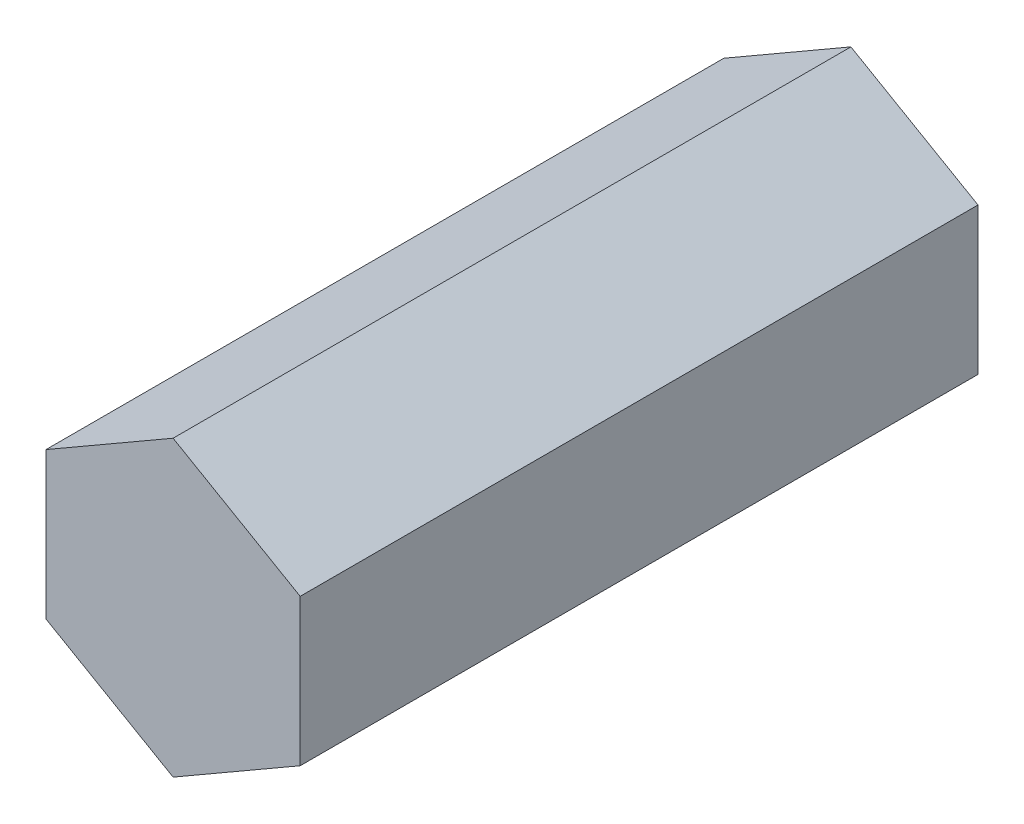
ISO-10303-21;
HEADER;
FILE_DESCRIPTION(('STEP AP214'),'2;1');
FILE_NAME('part.step','',(''),(''),'','','');
FILE_SCHEMA(('AUTOMOTIVE_DESIGN { 1 0 10303 214 1 1 1 1 }'));
ENDSEC;
DATA;
#1=APPLICATION_CONTEXT('core data for automotive mechanical design processes');
#2=APPLICATION_PROTOCOL_DEFINITION('international standard','automotive_design',2000,#1);
#3=PRODUCT_CONTEXT('',#1,'mechanical');
#4=PRODUCT('Part','Part','',(#3));
#5=PRODUCT_RELATED_PRODUCT_CATEGORY('part','',(#4));
#6=PRODUCT_DEFINITION_FORMATION('','',#4);
#7=PRODUCT_DEFINITION_CONTEXT('part definition',#1,'design');
#8=PRODUCT_DEFINITION('design','',#6,#7);
#9=PRODUCT_DEFINITION_SHAPE('','',#8);
#10=(LENGTH_UNIT() NAMED_UNIT(*) SI_UNIT(.MILLI.,.METRE.));
#11=(NAMED_UNIT(*) PLANE_ANGLE_UNIT() SI_UNIT($,.RADIAN.));
#12=(NAMED_UNIT(*) SI_UNIT($,.STERADIAN.) SOLID_ANGLE_UNIT());
#13=UNCERTAINTY_MEASURE_WITH_UNIT(LENGTH_MEASURE(1.E-05),#10,'distance_accuracy_value','');
#14=(GEOMETRIC_REPRESENTATION_CONTEXT(3) GLOBAL_UNCERTAINTY_ASSIGNED_CONTEXT((#13)) GLOBAL_UNIT_ASSIGNED_CONTEXT((#10,
#11,#12)) REPRESENTATION_CONTEXT('',''));
#15=CARTESIAN_POINT('',(0.,0.,0.));
#16=DIRECTION('',(0.,0.,1.));
#17=DIRECTION('',(1.,0.,0.));
#18=AXIS2_PLACEMENT_3D('',#15,#16,#17);
#19=CARTESIAN_POINT('',(1.49999999999999,0.866025403784457,8.));
#20=DIRECTION('',(-0.499999999999995,-0.866025403784441,0.));
#21=DIRECTION('',(0.866025403784442,-0.499999999999995,0.));
#22=AXIS2_PLACEMENT_3D('',#19,#20,#21);
#23=PLANE('',#22);
#24=DIRECTION('',(-0.866025403784441,0.499999999999995,0.));
#25=VECTOR('',#24,1.);
#26=CARTESIAN_POINT('',(1.49999999999999,0.866025403784457,0.));
#27=LINE('',#26,#25);
#28=CARTESIAN_POINT('',(1.49999999999999,0.866025403784457,0.));
#29=VERTEX_POINT('',#28);
#30=CARTESIAN_POINT('',(0.,1.73205080756888,0.));
#31=VERTEX_POINT('',#30);
#32=EDGE_CURVE('E128',#29,#31,#27,.T.);
#33=ORIENTED_EDGE('',*,*,#32,.T.);
#34=DIRECTION('',(0.,0.,-1.));
#35=VECTOR('',#34,1.);
#36=CARTESIAN_POINT('',(0.,1.73205080756888,8.));
#37=LINE('',#36,#35);
#38=CARTESIAN_POINT('',(0.,1.73205080756888,8.));
#39=VERTEX_POINT('',#38);
#40=EDGE_CURVE('E11',#39,#31,#37,.T.);
#41=ORIENTED_EDGE('',*,*,#40,.F.);
#42=DIRECTION('',(-0.866025403784441,0.499999999999995,0.));
#43=VECTOR('',#42,1.);
#44=CARTESIAN_POINT('',(1.49999999999999,0.866025403784457,8.));
#45=LINE('',#44,#43);
#46=CARTESIAN_POINT('',(1.49999999999999,0.866025403784457,8.));
#47=VERTEX_POINT('',#46);
#48=EDGE_CURVE('E144',#47,#39,#45,.T.);
#49=ORIENTED_EDGE('',*,*,#48,.F.);
#50=DIRECTION('',(0.,0.,-1.));
#51=VECTOR('',#50,1.);
#52=CARTESIAN_POINT('',(1.49999999999999,0.866025403784457,8.));
#53=LINE('',#52,#51);
#54=EDGE_CURVE('E124',#47,#29,#53,.T.);
#55=ORIENTED_EDGE('',*,*,#54,.T.);
#56=EDGE_LOOP('',(#33,#41,#49,#55));
#57=FACE_BOUND('',#56,.T.);
#58=ADVANCED_FACE('F39',(#57),#23,.F.);
#59=CARTESIAN_POINT('',(0.,1.73205080756888,8.));
#60=DIRECTION('',(0.500000000000001,-0.866025403784438,0.));
#61=DIRECTION('',(0.866025403784438,0.500000000000001,0.));
#62=AXIS2_PLACEMENT_3D('',#59,#60,#61);
#63=PLANE('',#62);
#64=DIRECTION('',(-0.866025403784438,-0.500000000000001,0.));
#65=VECTOR('',#64,1.);
#66=CARTESIAN_POINT('',(0.,1.73205080756888,0.));
#67=LINE('',#66,#65);
#68=CARTESIAN_POINT('',(-1.5,0.866025403784436,0.));
#69=VERTEX_POINT('',#68);
#70=EDGE_CURVE('E132',#31,#69,#67,.T.);
#71=ORIENTED_EDGE('',*,*,#70,.T.);
#72=DIRECTION('',(0.,0.,-1.));
#73=VECTOR('',#72,1.);
#74=CARTESIAN_POINT('',(-1.5,0.866025403784436,8.));
#75=LINE('',#74,#73);
#76=CARTESIAN_POINT('',(-1.5,0.866025403784436,8.));
#77=VERTEX_POINT('',#76);
#78=EDGE_CURVE('E48',#77,#69,#75,.T.);
#79=ORIENTED_EDGE('',*,*,#78,.F.);
#80=DIRECTION('',(-0.866025403784438,-0.500000000000001,0.));
#81=VECTOR('',#80,1.);
#82=CARTESIAN_POINT('',(0.,1.73205080756888,8.));
#83=LINE('',#82,#81);
#84=EDGE_CURVE('E93',#39,#77,#83,.T.);
#85=ORIENTED_EDGE('',*,*,#84,.F.);
#86=ORIENTED_EDGE('',*,*,#40,.T.);
#87=EDGE_LOOP('',(#71,#79,#85,#86));
#88=FACE_BOUND('',#87,.T.);
#89=ADVANCED_FACE('F172',(#88),#63,.F.);
#90=CARTESIAN_POINT('',(-1.5,0.866025403784436,8.));
#91=DIRECTION('',(1.,0.,0.));
#92=DIRECTION('',(0.,1.,0.));
#93=AXIS2_PLACEMENT_3D('',#90,#91,#92);
#94=PLANE('',#93);
#95=DIRECTION('',(0.,-1.,0.));
#96=VECTOR('',#95,1.);
#97=CARTESIAN_POINT('',(-1.5,0.866025403784436,0.));
#98=LINE('',#97,#96);
#99=CARTESIAN_POINT('',(-1.5,-0.866025403784446,0.));
#100=VERTEX_POINT('',#99);
#101=EDGE_CURVE('E135',#69,#100,#98,.T.);
#102=ORIENTED_EDGE('',*,*,#101,.T.);
#103=DIRECTION('',(0.,0.,-1.));
#104=VECTOR('',#103,1.);
#105=CARTESIAN_POINT('',(-1.5,-0.866025403784446,8.));
#106=LINE('',#105,#104);
#107=CARTESIAN_POINT('',(-1.5,-0.866025403784446,8.));
#108=VERTEX_POINT('',#107);
#109=EDGE_CURVE('E117',#108,#100,#106,.T.);
#110=ORIENTED_EDGE('',*,*,#109,.F.);
#111=DIRECTION('',(0.,-1.,0.));
#112=VECTOR('',#111,1.);
#113=CARTESIAN_POINT('',(-1.5,0.866025403784436,8.));
#114=LINE('',#113,#112);
#115=EDGE_CURVE('E106',#77,#108,#114,.T.);
#116=ORIENTED_EDGE('',*,*,#115,.F.);
#117=ORIENTED_EDGE('',*,*,#78,.T.);
#118=EDGE_LOOP('',(#102,#110,#116,#117));
#119=FACE_BOUND('',#118,.T.);
#120=ADVANCED_FACE('F154',(#119),#94,.F.);
#121=CARTESIAN_POINT('',(-1.5,-0.866025403784446,8.));
#122=DIRECTION('',(0.499999999999995,0.866025403784441,0.));
#123=DIRECTION('',(-0.866025403784442,0.499999999999995,0.));
#124=AXIS2_PLACEMENT_3D('',#121,#122,#123);
#125=PLANE('',#124);
#126=DIRECTION('',(0.866025403784441,-0.499999999999995,0.));
#127=VECTOR('',#126,1.);
#128=CARTESIAN_POINT('',(-1.5,-0.866025403784446,0.));
#129=LINE('',#128,#127);
#130=CARTESIAN_POINT('',(0.,-1.73205080756888,0.));
#131=VERTEX_POINT('',#130);
#132=EDGE_CURVE('E115',#100,#131,#129,.T.);
#133=ORIENTED_EDGE('',*,*,#132,.T.);
#134=DIRECTION('',(0.,0.,-1.));
#135=VECTOR('',#134,1.);
#136=CARTESIAN_POINT('',(0.,-1.73205080756888,8.));
#137=LINE('',#136,#135);
#138=CARTESIAN_POINT('',(0.,-1.73205080756888,8.));
#139=VERTEX_POINT('',#138);
#140=EDGE_CURVE('E112',#139,#131,#137,.T.);
#141=ORIENTED_EDGE('',*,*,#140,.F.);
#142=DIRECTION('',(0.866025403784441,-0.499999999999995,0.));
#143=VECTOR('',#142,1.);
#144=CARTESIAN_POINT('',(-1.5,-0.866025403784446,8.));
#145=LINE('',#144,#143);
#146=EDGE_CURVE('E100',#108,#139,#145,.T.);
#147=ORIENTED_EDGE('',*,*,#146,.F.);
#148=ORIENTED_EDGE('',*,*,#109,.T.);
#149=EDGE_LOOP('',(#133,#141,#147,#148));
#150=FACE_BOUND('',#149,.T.);
#151=ADVANCED_FACE('F113',(#150),#125,.F.);
#152=CARTESIAN_POINT('',(0.,-1.73205080756888,8.));
#153=DIRECTION('',(-0.500000000000007,0.866025403784435,0.));
#154=DIRECTION('',(-0.866025403784435,-0.500000000000007,0.));
#155=AXIS2_PLACEMENT_3D('',#152,#153,#154);
#156=PLANE('',#155);
#157=DIRECTION('',(0.866025403784435,0.500000000000007,0.));
#158=VECTOR('',#157,1.);
#159=CARTESIAN_POINT('',(0.,-1.73205080756888,0.));
#160=LINE('',#159,#158);
#161=CARTESIAN_POINT('',(1.50000000000001,-0.866025403784425,0.));
#162=VERTEX_POINT('',#161);
#163=EDGE_CURVE('E79',#131,#162,#160,.T.);
#164=ORIENTED_EDGE('',*,*,#163,.T.);
#165=DIRECTION('',(0.,0.,-1.));
#166=VECTOR('',#165,1.);
#167=CARTESIAN_POINT('',(1.50000000000001,-0.866025403784425,8.));
#168=LINE('',#167,#166);
#169=CARTESIAN_POINT('',(1.50000000000001,-0.866025403784425,8.));
#170=VERTEX_POINT('',#169);
#171=EDGE_CURVE('E118',#170,#162,#168,.T.);
#172=ORIENTED_EDGE('',*,*,#171,.F.);
#173=DIRECTION('',(0.866025403784435,0.500000000000007,0.));
#174=VECTOR('',#173,1.);
#175=CARTESIAN_POINT('',(0.,-1.73205080756888,8.));
#176=LINE('',#175,#174);
#177=EDGE_CURVE('E104',#139,#170,#176,.T.);
#178=ORIENTED_EDGE('',*,*,#177,.F.);
#179=ORIENTED_EDGE('',*,*,#140,.T.);
#180=EDGE_LOOP('',(#164,#172,#178,#179));
#181=FACE_BOUND('',#180,.T.);
#182=ADVANCED_FACE('F120',(#181),#156,.F.);
#183=CARTESIAN_POINT('',(1.50000000000001,-0.866025403784425,8.));
#184=DIRECTION('',(-1.,0.,0.));
#185=DIRECTION('',(0.,-1.,0.));
#186=AXIS2_PLACEMENT_3D('',#183,#184,#185);
#187=PLANE('',#186);
#188=DIRECTION('',(0.,1.,0.));
#189=VECTOR('',#188,1.);
#190=CARTESIAN_POINT('',(1.50000000000001,-0.866025403784425,0.));
#191=LINE('',#190,#189);
#192=EDGE_CURVE('E85',#162,#29,#191,.T.);
#193=ORIENTED_EDGE('',*,*,#192,.T.);
#194=ORIENTED_EDGE('',*,*,#54,.F.);
#195=DIRECTION('',(0.,1.,0.));
#196=VECTOR('',#195,1.);
#197=CARTESIAN_POINT('',(1.50000000000001,-0.866025403784425,8.));
#198=LINE('',#197,#196);
#199=EDGE_CURVE('E56',#170,#47,#198,.T.);
#200=ORIENTED_EDGE('',*,*,#199,.F.);
#201=ORIENTED_EDGE('',*,*,#171,.T.);
#202=EDGE_LOOP('',(#193,#194,#200,#201));
#203=FACE_BOUND('',#202,.T.);
#204=ADVANCED_FACE('F161',(#203),#187,.F.);
#205=CARTESIAN_POINT('',(0.,0.,8.));
#206=DIRECTION('',(0.,0.,1.));
#207=DIRECTION('',(1.,0.,0.));
#208=AXIS2_PLACEMENT_3D('',#205,#206,#207);
#209=PLANE('',#208);
#210=ORIENTED_EDGE('',*,*,#48,.T.);
#211=ORIENTED_EDGE('',*,*,#84,.T.);
#212=ORIENTED_EDGE('',*,*,#115,.T.);
#213=ORIENTED_EDGE('',*,*,#146,.T.);
#214=ORIENTED_EDGE('',*,*,#177,.T.);
#215=ORIENTED_EDGE('',*,*,#199,.T.);
#216=EDGE_LOOP('',(#210,#211,#212,#213,#214,#215));
#217=FACE_BOUND('',#216,.T.);
#218=ADVANCED_FACE('F102',(#217),#209,.T.);
#219=CARTESIAN_POINT('',(0.,0.,0.));
#220=DIRECTION('',(0.,0.,1.));
#221=DIRECTION('',(1.,0.,0.));
#222=AXIS2_PLACEMENT_3D('',#219,#220,#221);
#223=PLANE('',#222);
#224=ORIENTED_EDGE('',*,*,#32,.F.);
#225=ORIENTED_EDGE('',*,*,#192,.F.);
#226=ORIENTED_EDGE('',*,*,#163,.F.);
#227=ORIENTED_EDGE('',*,*,#132,.F.);
#228=ORIENTED_EDGE('',*,*,#101,.F.);
#229=ORIENTED_EDGE('',*,*,#70,.F.);
#230=EDGE_LOOP('',(#224,#225,#226,#227,#228,#229));
#231=FACE_BOUND('',#230,.T.);
#232=ADVANCED_FACE('F157',(#231),#223,.F.);
#233=CLOSED_SHELL('',(#58,#89,#120,#151,#182,#204,#218,#232));
#234=MANIFOLD_SOLID_BREP('B2',#233);
#235=ADVANCED_BREP_SHAPE_REPRESENTATION('',(#18,#234),#14);
#236=SHAPE_DEFINITION_REPRESENTATION(#9,#235);
ENDSEC;
END-ISO-10303-21;
